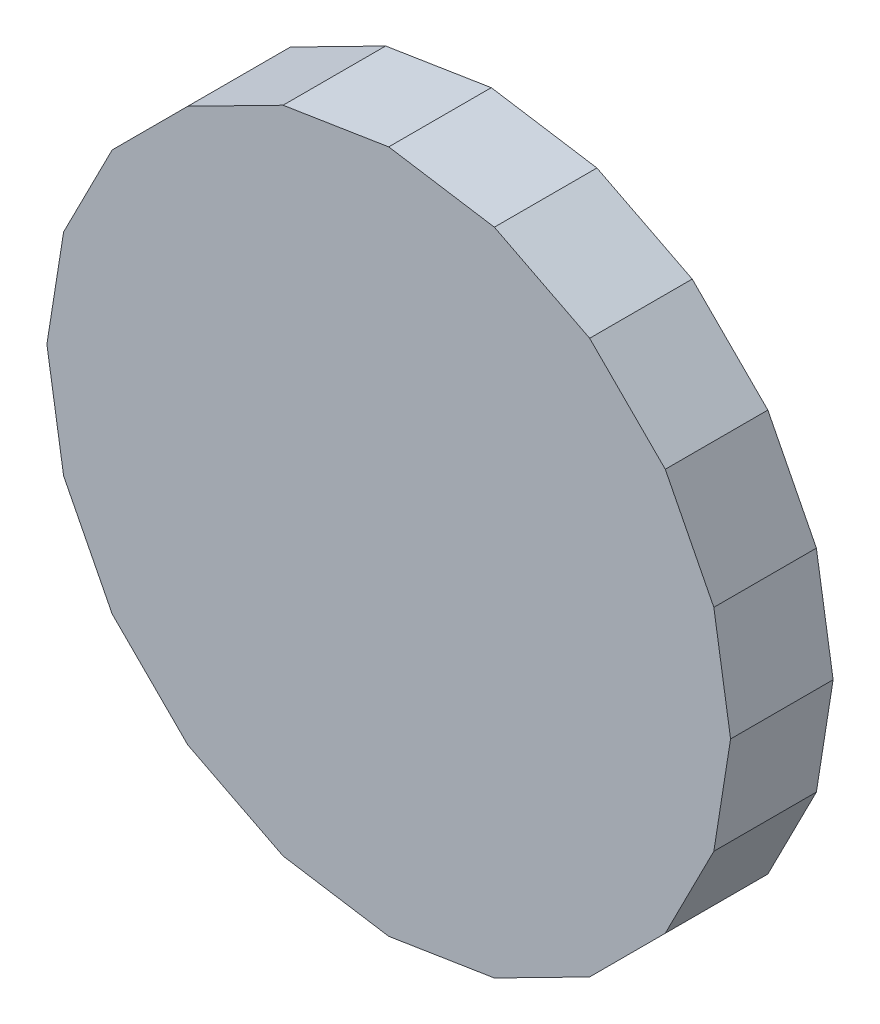
ISO-10303-21;
HEADER;
FILE_DESCRIPTION(('STEP AP214'),'2;1');
FILE_NAME('part.step','',(''),(''),'','','');
FILE_SCHEMA(('AUTOMOTIVE_DESIGN { 1 0 10303 214 1 1 1 1 }'));
ENDSEC;
DATA;
#1=APPLICATION_CONTEXT('core data for automotive mechanical design processes');
#2=APPLICATION_PROTOCOL_DEFINITION('international standard','automotive_design',2000,#1);
#3=PRODUCT_CONTEXT('',#1,'mechanical');
#4=PRODUCT('Part','Part','',(#3));
#5=PRODUCT_RELATED_PRODUCT_CATEGORY('part','',(#4));
#6=PRODUCT_DEFINITION_FORMATION('','',#4);
#7=PRODUCT_DEFINITION_CONTEXT('part definition',#1,'design');
#8=PRODUCT_DEFINITION('design','',#6,#7);
#9=PRODUCT_DEFINITION_SHAPE('','',#8);
#10=(LENGTH_UNIT() NAMED_UNIT(*) SI_UNIT(.MILLI.,.METRE.));
#11=(NAMED_UNIT(*) PLANE_ANGLE_UNIT() SI_UNIT($,.RADIAN.));
#12=(NAMED_UNIT(*) SI_UNIT($,.STERADIAN.) SOLID_ANGLE_UNIT());
#13=UNCERTAINTY_MEASURE_WITH_UNIT(LENGTH_MEASURE(1.E-05),#10,'distance_accuracy_value','');
#14=(GEOMETRIC_REPRESENTATION_CONTEXT(3) GLOBAL_UNCERTAINTY_ASSIGNED_CONTEXT((#13)) GLOBAL_UNIT_ASSIGNED_CONTEXT((#10,
#11,#12)) REPRESENTATION_CONTEXT('',''));
#15=CARTESIAN_POINT('',(0.,0.,0.));
#16=DIRECTION('',(0.,0.,1.));
#17=DIRECTION('',(1.,0.,0.));
#18=AXIS2_PLACEMENT_3D('',#15,#16,#17);
#19=CARTESIAN_POINT('',(95.1056516295157,-30.9016994374937,30.));
#20=DIRECTION('',(-0.987688340595139,0.156434465040221,0.));
#21=DIRECTION('',(-0.156434465040221,-0.987688340595139,0.));
#22=AXIS2_PLACEMENT_3D('',#19,#20,#21);
#23=PLANE('',#22);
#24=DIRECTION('',(0.156434465040221,0.987688340595139,0.));
#25=VECTOR('',#24,1.);
#26=CARTESIAN_POINT('',(95.1056516295157,-30.9016994374937,0.));
#27=LINE('',#26,#25);
#28=CARTESIAN_POINT('',(95.1056516295157,-30.9016994374937,0.));
#29=VERTEX_POINT('',#28);
#30=CARTESIAN_POINT('',(100.,1.14838694109665E-12,0.));
#31=VERTEX_POINT('',#30);
#32=EDGE_CURVE('E209',#29,#31,#27,.T.);
#33=ORIENTED_EDGE('',*,*,#32,.T.);
#34=DIRECTION('',(0.,0.,-1.));
#35=VECTOR('',#34,1.);
#36=CARTESIAN_POINT('',(100.,1.14838694109665E-12,30.));
#37=LINE('',#36,#35);
#38=CARTESIAN_POINT('',(100.,1.14838694109665E-12,30.));
#39=VERTEX_POINT('',#38);
#40=EDGE_CURVE('E11',#39,#31,#37,.T.);
#41=ORIENTED_EDGE('',*,*,#40,.F.);
#42=DIRECTION('',(0.156434465040221,0.987688340595139,0.));
#43=VECTOR('',#42,1.);
#44=CARTESIAN_POINT('',(95.1056516295157,-30.9016994374937,30.));
#45=LINE('',#44,#43);
#46=CARTESIAN_POINT('',(95.1056516295157,-30.9016994374937,30.));
#47=VERTEX_POINT('',#46);
#48=EDGE_CURVE('E247',#47,#39,#45,.T.);
#49=ORIENTED_EDGE('',*,*,#48,.F.);
#50=DIRECTION('',(0.,0.,-1.));
#51=VECTOR('',#50,1.);
#52=CARTESIAN_POINT('',(95.1056516295157,-30.9016994374937,30.));
#53=LINE('',#52,#51);
#54=EDGE_CURVE('E205',#47,#29,#53,.T.);
#55=ORIENTED_EDGE('',*,*,#54,.T.);
#56=EDGE_LOOP('',(#33,#41,#49,#55));
#57=FACE_BOUND('',#56,.T.);
#58=ADVANCED_FACE('F41',(#57),#23,.F.);
#59=CARTESIAN_POINT('',(100.,1.14838694109665E-12,30.));
#60=DIRECTION('',(-0.987688340595136,-0.156434465040243,0.));
#61=DIRECTION('',(0.156434465040243,-0.987688340595136,0.));
#62=AXIS2_PLACEMENT_3D('',#59,#60,#61);
#63=PLANE('',#62);
#64=DIRECTION('',(-0.156434465040243,0.987688340595136,0.));
#65=VECTOR('',#64,1.);
#66=CARTESIAN_POINT('',(100.,1.14838694109665E-12,0.));
#67=LINE('',#66,#65);
#68=CARTESIAN_POINT('',(95.105651629515,30.901699437496,0.));
#69=VERTEX_POINT('',#68);
#70=EDGE_CURVE('E212',#31,#69,#67,.T.);
#71=ORIENTED_EDGE('',*,*,#70,.T.);
#72=DIRECTION('',(0.,0.,-1.));
#73=VECTOR('',#72,1.);
#74=CARTESIAN_POINT('',(95.105651629515,30.901699437496,30.));
#75=LINE('',#74,#73);
#76=CARTESIAN_POINT('',(95.105651629515,30.901699437496,30.));
#77=VERTEX_POINT('',#76);
#78=EDGE_CURVE('E49',#77,#69,#75,.T.);
#79=ORIENTED_EDGE('',*,*,#78,.F.);
#80=DIRECTION('',(-0.156434465040243,0.987688340595136,0.));
#81=VECTOR('',#80,1.);
#82=CARTESIAN_POINT('',(100.,1.14838694109665E-12,30.));
#83=LINE('',#82,#81);
#84=EDGE_CURVE('E136',#39,#77,#83,.T.);
#85=ORIENTED_EDGE('',*,*,#84,.F.);
#86=ORIENTED_EDGE('',*,*,#40,.T.);
#87=EDGE_LOOP('',(#71,#79,#85,#86));
#88=FACE_BOUND('',#87,.T.);
#89=ADVANCED_FACE('F365',(#88),#63,.F.);
#90=CARTESIAN_POINT('',(95.105651629515,30.901699437496,30.));
#91=DIRECTION('',(-0.891006524188364,-0.453990499739555,0.));
#92=DIRECTION('',(0.453990499739555,-0.891006524188364,0.));
#93=AXIS2_PLACEMENT_3D('',#90,#91,#92);
#94=PLANE('',#93);
#95=DIRECTION('',(-0.453990499739555,0.891006524188364,0.));
#96=VECTOR('',#95,1.);
#97=CARTESIAN_POINT('',(95.105651629515,30.901699437496,0.));
#98=LINE('',#97,#96);
#99=CARTESIAN_POINT('',(80.9016994374942,58.7785252292483,0.));
#100=VERTEX_POINT('',#99);
#101=EDGE_CURVE('E214',#69,#100,#98,.T.);
#102=ORIENTED_EDGE('',*,*,#101,.T.);
#103=DIRECTION('',(0.,0.,-1.));
#104=VECTOR('',#103,1.);
#105=CARTESIAN_POINT('',(80.9016994374942,58.7785252292483,30.));
#106=LINE('',#105,#104);
#107=CARTESIAN_POINT('',(80.9016994374942,58.7785252292483,30.));
#108=VERTEX_POINT('',#107);
#109=EDGE_CURVE('E290',#108,#100,#106,.T.);
#110=ORIENTED_EDGE('',*,*,#109,.F.);
#111=DIRECTION('',(-0.453990499739555,0.891006524188364,0.));
#112=VECTOR('',#111,1.);
#113=CARTESIAN_POINT('',(95.105651629515,30.901699437496,30.));
#114=LINE('',#113,#112);
#115=EDGE_CURVE('E298',#77,#108,#114,.T.);
#116=ORIENTED_EDGE('',*,*,#115,.F.);
#117=ORIENTED_EDGE('',*,*,#78,.T.);
#118=EDGE_LOOP('',(#102,#110,#116,#117));
#119=FACE_BOUND('',#118,.T.);
#120=ADVANCED_FACE('F296',(#119),#94,.F.);
#121=CARTESIAN_POINT('',(80.9016994374942,58.7785252292483,30.));
#122=DIRECTION('',(-0.70710678118654,-0.707106781186555,0.));
#123=DIRECTION('',(0.707106781186555,-0.70710678118654,0.));
#124=AXIS2_PLACEMENT_3D('',#121,#122,#123);
#125=PLANE('',#124);
#126=DIRECTION('',(-0.707106781186555,0.70710678118654,0.));
#127=VECTOR('',#126,1.);
#128=CARTESIAN_POINT('',(80.9016994374942,58.7785252292483,0.));
#129=LINE('',#128,#127);
#130=CARTESIAN_POINT('',(58.7785252292465,80.9016994374955,0.));
#131=VERTEX_POINT('',#130);
#132=EDGE_CURVE('E216',#100,#131,#129,.T.);
#133=ORIENTED_EDGE('',*,*,#132,.T.);
#134=DIRECTION('',(0.,0.,-1.));
#135=VECTOR('',#134,1.);
#136=CARTESIAN_POINT('',(58.7785252292465,80.9016994374955,30.));
#137=LINE('',#136,#135);
#138=CARTESIAN_POINT('',(58.7785252292465,80.9016994374955,30.));
#139=VERTEX_POINT('',#138);
#140=EDGE_CURVE('E287',#139,#131,#137,.T.);
#141=ORIENTED_EDGE('',*,*,#140,.F.);
#142=DIRECTION('',(-0.707106781186555,0.70710678118654,0.));
#143=VECTOR('',#142,1.);
#144=CARTESIAN_POINT('',(80.9016994374942,58.7785252292483,30.));
#145=LINE('',#144,#143);
#146=EDGE_CURVE('E316',#108,#139,#145,.T.);
#147=ORIENTED_EDGE('',*,*,#146,.F.);
#148=ORIENTED_EDGE('',*,*,#109,.T.);
#149=EDGE_LOOP('',(#133,#141,#147,#148));
#150=FACE_BOUND('',#149,.T.);
#151=ADVANCED_FACE('F307',(#150),#125,.F.);
#152=CARTESIAN_POINT('',(58.7785252292465,80.9016994374955,30.));
#153=DIRECTION('',(-0.453990499739535,-0.891006524188374,0.));
#154=DIRECTION('',(0.891006524188374,-0.453990499739535,0.));
#155=AXIS2_PLACEMENT_3D('',#152,#153,#154);
#156=PLANE('',#155);
#157=DIRECTION('',(-0.891006524188374,0.453990499739535,0.));
#158=VECTOR('',#157,1.);
#159=CARTESIAN_POINT('',(58.7785252292465,80.9016994374955,0.));
#160=LINE('',#159,#158);
#161=CARTESIAN_POINT('',(30.9016994374936,95.1056516295158,0.));
#162=VERTEX_POINT('',#161);
#163=EDGE_CURVE('E218',#131,#162,#160,.T.);
#164=ORIENTED_EDGE('',*,*,#163,.T.);
#165=DIRECTION('',(0.,0.,-1.));
#166=VECTOR('',#165,1.);
#167=CARTESIAN_POINT('',(30.9016994374936,95.1056516295158,30.));
#168=LINE('',#167,#166);
#169=CARTESIAN_POINT('',(30.9016994374936,95.1056516295158,30.));
#170=VERTEX_POINT('',#169);
#171=EDGE_CURVE('E284',#170,#162,#168,.T.);
#172=ORIENTED_EDGE('',*,*,#171,.F.);
#173=DIRECTION('',(-0.891006524188374,0.453990499739535,0.));
#174=VECTOR('',#173,1.);
#175=CARTESIAN_POINT('',(58.7785252292465,80.9016994374955,30.));
#176=LINE('',#175,#174);
#177=EDGE_CURVE('E313',#139,#170,#176,.T.);
#178=ORIENTED_EDGE('',*,*,#177,.F.);
#179=ORIENTED_EDGE('',*,*,#140,.T.);
#180=EDGE_LOOP('',(#164,#172,#178,#179));
#181=FACE_BOUND('',#180,.T.);
#182=ADVANCED_FACE('F311',(#181),#156,.F.);
#183=CARTESIAN_POINT('',(30.9016994374936,95.1056516295158,30.));
#184=DIRECTION('',(-0.156434465040219,-0.98768834059514,0.));
#185=DIRECTION('',(0.98768834059514,-0.156434465040219,0.));
#186=AXIS2_PLACEMENT_3D('',#183,#184,#185);
#187=PLANE('',#186);
#188=DIRECTION('',(-0.98768834059514,0.156434465040219,0.));
#189=VECTOR('',#188,1.);
#190=CARTESIAN_POINT('',(30.9016994374936,95.1056516295158,0.));
#191=LINE('',#190,#189);
#192=CARTESIAN_POINT('',(-1.12757025938492E-12,100.,0.));
#193=VERTEX_POINT('',#192);
#194=EDGE_CURVE('E220',#162,#193,#191,.T.);
#195=ORIENTED_EDGE('',*,*,#194,.T.);
#196=DIRECTION('',(0.,0.,-1.));
#197=VECTOR('',#196,1.);
#198=CARTESIAN_POINT('',(-1.12757025938492E-12,100.,30.));
#199=LINE('',#198,#197);
#200=CARTESIAN_POINT('',(-1.12757025938492E-12,100.,30.));
#201=VERTEX_POINT('',#200);
#202=EDGE_CURVE('E281',#201,#193,#199,.T.);
#203=ORIENTED_EDGE('',*,*,#202,.F.);
#204=DIRECTION('',(-0.98768834059514,0.156434465040219,0.));
#205=VECTOR('',#204,1.);
#206=CARTESIAN_POINT('',(30.9016994374936,95.1056516295158,30.));
#207=LINE('',#206,#205);
#208=EDGE_CURVE('E315',#170,#201,#207,.T.);
#209=ORIENTED_EDGE('',*,*,#208,.F.);
#210=ORIENTED_EDGE('',*,*,#171,.T.);
#211=EDGE_LOOP('',(#195,#203,#209,#210));
#212=FACE_BOUND('',#211,.T.);
#213=ADVANCED_FACE('F378',(#212),#187,.F.);
#214=CARTESIAN_POINT('',(-1.12757025938492E-12,100.,30.));
#215=DIRECTION('',(0.156434465040242,-0.987688340595136,0.));
#216=DIRECTION('',(0.987688340595136,0.156434465040242,0.));
#217=AXIS2_PLACEMENT_3D('',#214,#215,#216);
#218=PLANE('',#217);
#219=DIRECTION('',(-0.987688340595136,-0.156434465040242,0.));
#220=VECTOR('',#219,1.);
#221=CARTESIAN_POINT('',(-1.12757025938492E-12,100.,0.));
#222=LINE('',#221,#220);
#223=CARTESIAN_POINT('',(-30.9016994374958,95.1056516295151,0.));
#224=VERTEX_POINT('',#223);
#225=EDGE_CURVE('E222',#193,#224,#222,.T.);
#226=ORIENTED_EDGE('',*,*,#225,.T.);
#227=DIRECTION('',(0.,0.,-1.));
#228=VECTOR('',#227,1.);
#229=CARTESIAN_POINT('',(-30.9016994374958,95.1056516295151,30.));
#230=LINE('',#229,#228);
#231=CARTESIAN_POINT('',(-30.9016994374958,95.1056516295151,30.));
#232=VERTEX_POINT('',#231);
#233=EDGE_CURVE('E278',#232,#224,#230,.T.);
#234=ORIENTED_EDGE('',*,*,#233,.F.);
#235=DIRECTION('',(-0.987688340595136,-0.156434465040242,0.));
#236=VECTOR('',#235,1.);
#237=CARTESIAN_POINT('',(-1.12757025938492E-12,100.,30.));
#238=LINE('',#237,#236);
#239=EDGE_CURVE('E318',#201,#232,#238,.T.);
#240=ORIENTED_EDGE('',*,*,#239,.F.);
#241=ORIENTED_EDGE('',*,*,#202,.T.);
#242=EDGE_LOOP('',(#226,#234,#240,#241));
#243=FACE_BOUND('',#242,.T.);
#244=ADVANCED_FACE('F381',(#243),#218,.F.);
#245=CARTESIAN_POINT('',(-30.9016994374958,95.1056516295151,30.));
#246=DIRECTION('',(0.453990499739557,-0.891006524188363,0.));
#247=DIRECTION('',(0.891006524188363,0.453990499739557,0.));
#248=AXIS2_PLACEMENT_3D('',#245,#246,#247);
#249=PLANE('',#248);
#250=DIRECTION('',(-0.891006524188362,-0.453990499739557,0.));
#251=VECTOR('',#250,1.);
#252=CARTESIAN_POINT('',(-30.9016994374958,95.1056516295151,0.));
#253=LINE('',#252,#251);
#254=CARTESIAN_POINT('',(-58.7785252292482,80.9016994374941,0.));
#255=VERTEX_POINT('',#254);
#256=EDGE_CURVE('E224',#224,#255,#253,.T.);
#257=ORIENTED_EDGE('',*,*,#256,.T.);
#258=DIRECTION('',(0.,0.,-1.));
#259=VECTOR('',#258,1.);
#260=CARTESIAN_POINT('',(-58.7785252292482,80.9016994374941,30.));
#261=LINE('',#260,#259);
#262=CARTESIAN_POINT('',(-58.7785252292482,80.9016994374941,30.));
#263=VERTEX_POINT('',#262);
#264=EDGE_CURVE('E275',#263,#255,#261,.T.);
#265=ORIENTED_EDGE('',*,*,#264,.F.);
#266=DIRECTION('',(-0.891006524188362,-0.453990499739557,0.));
#267=VECTOR('',#266,1.);
#268=CARTESIAN_POINT('',(-30.9016994374958,95.1056516295151,30.));
#269=LINE('',#268,#267);
#270=EDGE_CURVE('E324',#232,#263,#269,.T.);
#271=ORIENTED_EDGE('',*,*,#270,.F.);
#272=ORIENTED_EDGE('',*,*,#233,.T.);
#273=EDGE_LOOP('',(#257,#265,#271,#272));
#274=FACE_BOUND('',#273,.T.);
#275=ADVANCED_FACE('F385',(#274),#249,.F.);
#276=CARTESIAN_POINT('',(-58.7785252292482,80.9016994374941,30.));
#277=DIRECTION('',(0.707106781186555,-0.70710678118654,0.));
#278=DIRECTION('',(0.70710678118654,0.707106781186555,0.));
#279=AXIS2_PLACEMENT_3D('',#276,#277,#278);
#280=PLANE('',#279);
#281=DIRECTION('',(-0.70710678118654,-0.707106781186555,0.));
#282=VECTOR('',#281,1.);
#283=CARTESIAN_POINT('',(-58.7785252292482,80.9016994374941,0.));
#284=LINE('',#283,#282);
#285=CARTESIAN_POINT('',(-80.9016994374954,58.7785252292465,0.));
#286=VERTEX_POINT('',#285);
#287=EDGE_CURVE('E226',#255,#286,#284,.T.);
#288=ORIENTED_EDGE('',*,*,#287,.T.);
#289=DIRECTION('',(0.,0.,-1.));
#290=VECTOR('',#289,1.);
#291=CARTESIAN_POINT('',(-80.9016994374954,58.7785252292465,30.));
#292=LINE('',#291,#290);
#293=CARTESIAN_POINT('',(-80.9016994374954,58.7785252292465,30.));
#294=VERTEX_POINT('',#293);
#295=EDGE_CURVE('E272',#294,#286,#292,.T.);
#296=ORIENTED_EDGE('',*,*,#295,.F.);
#297=DIRECTION('',(-0.70710678118654,-0.707106781186555,0.));
#298=VECTOR('',#297,1.);
#299=CARTESIAN_POINT('',(-58.7785252292482,80.9016994374941,30.));
#300=LINE('',#299,#298);
#301=EDGE_CURVE('E326',#263,#294,#300,.T.);
#302=ORIENTED_EDGE('',*,*,#301,.F.);
#303=ORIENTED_EDGE('',*,*,#264,.T.);
#304=EDGE_LOOP('',(#288,#296,#302,#303));
#305=FACE_BOUND('',#304,.T.);
#306=ADVANCED_FACE('F389',(#305),#280,.F.);
#307=CARTESIAN_POINT('',(-80.9016994374954,58.7785252292465,30.));
#308=DIRECTION('',(0.891006524188373,-0.453990499739538,0.));
#309=DIRECTION('',(0.453990499739538,0.891006524188373,0.));
#310=AXIS2_PLACEMENT_3D('',#307,#308,#309);
#311=PLANE('',#310);
#312=DIRECTION('',(-0.453990499739537,-0.891006524188373,0.));
#313=VECTOR('',#312,1.);
#314=CARTESIAN_POINT('',(-80.9016994374954,58.7785252292465,0.));
#315=LINE('',#314,#313);
#316=CARTESIAN_POINT('',(-95.1056516295158,30.9016994374937,0.));
#317=VERTEX_POINT('',#316);
#318=EDGE_CURVE('E228',#286,#317,#315,.T.);
#319=ORIENTED_EDGE('',*,*,#318,.T.);
#320=DIRECTION('',(0.,0.,-1.));
#321=VECTOR('',#320,1.);
#322=CARTESIAN_POINT('',(-95.1056516295158,30.9016994374937,30.));
#323=LINE('',#322,#321);
#324=CARTESIAN_POINT('',(-95.1056516295158,30.9016994374937,30.));
#325=VERTEX_POINT('',#324);
#326=EDGE_CURVE('E269',#325,#317,#323,.T.);
#327=ORIENTED_EDGE('',*,*,#326,.F.);
#328=DIRECTION('',(-0.453990499739537,-0.891006524188373,0.));
#329=VECTOR('',#328,1.);
#330=CARTESIAN_POINT('',(-80.9016994374954,58.7785252292465,30.));
#331=LINE('',#330,#329);
#332=EDGE_CURVE('E328',#294,#325,#331,.T.);
#333=ORIENTED_EDGE('',*,*,#332,.F.);
#334=ORIENTED_EDGE('',*,*,#295,.T.);
#335=EDGE_LOOP('',(#319,#327,#333,#334));
#336=FACE_BOUND('',#335,.T.);
#337=ADVANCED_FACE('F393',(#336),#311,.F.);
#338=CARTESIAN_POINT('',(-95.1056516295158,30.9016994374937,30.));
#339=DIRECTION('',(0.98768834059514,-0.156434465040219,0.));
#340=DIRECTION('',(0.156434465040219,0.98768834059514,0.));
#341=AXIS2_PLACEMENT_3D('',#338,#339,#340);
#342=PLANE('',#341);
#343=DIRECTION('',(-0.156434465040219,-0.98768834059514,0.));
#344=VECTOR('',#343,1.);
#345=CARTESIAN_POINT('',(-95.1056516295158,30.9016994374937,0.));
#346=LINE('',#345,#344);
#347=CARTESIAN_POINT('',(-100.,-1.11716191852906E-12,0.));
#348=VERTEX_POINT('',#347);
#349=EDGE_CURVE('E230',#317,#348,#346,.T.);
#350=ORIENTED_EDGE('',*,*,#349,.T.);
#351=DIRECTION('',(0.,0.,-1.));
#352=VECTOR('',#351,1.);
#353=CARTESIAN_POINT('',(-100.,-1.11716191852906E-12,30.));
#354=LINE('',#353,#352);
#355=CARTESIAN_POINT('',(-100.,-1.11716191852906E-12,30.));
#356=VERTEX_POINT('',#355);
#357=EDGE_CURVE('E266',#356,#348,#354,.T.);
#358=ORIENTED_EDGE('',*,*,#357,.F.);
#359=DIRECTION('',(-0.156434465040219,-0.98768834059514,0.));
#360=VECTOR('',#359,1.);
#361=CARTESIAN_POINT('',(-95.1056516295158,30.9016994374937,30.));
#362=LINE('',#361,#360);
#363=EDGE_CURVE('E330',#325,#356,#362,.T.);
#364=ORIENTED_EDGE('',*,*,#363,.F.);
#365=ORIENTED_EDGE('',*,*,#326,.T.);
#366=EDGE_LOOP('',(#350,#358,#364,#365));
#367=FACE_BOUND('',#366,.T.);
#368=ADVANCED_FACE('F397',(#367),#342,.F.);
#369=CARTESIAN_POINT('',(-100.,-1.11716191852906E-12,30.));
#370=DIRECTION('',(0.987688340595136,0.156434465040243,0.));
#371=DIRECTION('',(-0.156434465040243,0.987688340595136,0.));
#372=AXIS2_PLACEMENT_3D('',#369,#370,#371);
#373=PLANE('',#372);
#374=DIRECTION('',(0.156434465040243,-0.987688340595136,0.));
#375=VECTOR('',#374,1.);
#376=CARTESIAN_POINT('',(-100.,-1.11716191852906E-12,0.));
#377=LINE('',#376,#375);
#378=CARTESIAN_POINT('',(-95.105651629515,-30.9016994374958,0.));
#379=VERTEX_POINT('',#378);
#380=EDGE_CURVE('E232',#348,#379,#377,.T.);
#381=ORIENTED_EDGE('',*,*,#380,.T.);
#382=DIRECTION('',(0.,0.,-1.));
#383=VECTOR('',#382,1.);
#384=CARTESIAN_POINT('',(-95.105651629515,-30.9016994374958,30.));
#385=LINE('',#384,#383);
#386=CARTESIAN_POINT('',(-95.105651629515,-30.9016994374958,30.));
#387=VERTEX_POINT('',#386);
#388=EDGE_CURVE('E263',#387,#379,#385,.T.);
#389=ORIENTED_EDGE('',*,*,#388,.F.);
#390=DIRECTION('',(0.156434465040243,-0.987688340595136,0.));
#391=VECTOR('',#390,1.);
#392=CARTESIAN_POINT('',(-100.,-1.11716191852906E-12,30.));
#393=LINE('',#392,#391);
#394=EDGE_CURVE('E332',#356,#387,#393,.T.);
#395=ORIENTED_EDGE('',*,*,#394,.F.);
#396=ORIENTED_EDGE('',*,*,#357,.T.);
#397=EDGE_LOOP('',(#381,#389,#395,#396));
#398=FACE_BOUND('',#397,.T.);
#399=ADVANCED_FACE('F401',(#398),#373,.F.);
#400=CARTESIAN_POINT('',(-95.105651629515,-30.9016994374958,30.));
#401=DIRECTION('',(0.891006524188363,0.453990499739556,0.));
#402=DIRECTION('',(-0.453990499739556,0.891006524188363,0.));
#403=AXIS2_PLACEMENT_3D('',#400,#401,#402);
#404=PLANE('',#403);
#405=DIRECTION('',(0.453990499739556,-0.891006524188363,0.));
#406=VECTOR('',#405,1.);
#407=CARTESIAN_POINT('',(-95.105651629515,-30.9016994374958,0.));
#408=LINE('',#407,#406);
#409=CARTESIAN_POINT('',(-80.9016994374941,-58.7785252292483,0.));
#410=VERTEX_POINT('',#409);
#411=EDGE_CURVE('E234',#379,#410,#408,.T.);
#412=ORIENTED_EDGE('',*,*,#411,.T.);
#413=DIRECTION('',(0.,0.,-1.));
#414=VECTOR('',#413,1.);
#415=CARTESIAN_POINT('',(-80.9016994374941,-58.7785252292483,30.));
#416=LINE('',#415,#414);
#417=CARTESIAN_POINT('',(-80.9016994374941,-58.7785252292483,30.));
#418=VERTEX_POINT('',#417);
#419=EDGE_CURVE('E260',#418,#410,#416,.T.);
#420=ORIENTED_EDGE('',*,*,#419,.F.);
#421=DIRECTION('',(0.453990499739556,-0.891006524188363,0.));
#422=VECTOR('',#421,1.);
#423=CARTESIAN_POINT('',(-95.105651629515,-30.9016994374958,30.));
#424=LINE('',#423,#422);
#425=EDGE_CURVE('E334',#387,#418,#424,.T.);
#426=ORIENTED_EDGE('',*,*,#425,.F.);
#427=ORIENTED_EDGE('',*,*,#388,.T.);
#428=EDGE_LOOP('',(#412,#420,#426,#427));
#429=FACE_BOUND('',#428,.T.);
#430=ADVANCED_FACE('F405',(#429),#404,.F.);
#431=CARTESIAN_POINT('',(-80.9016994374941,-58.7785252292483,30.));
#432=DIRECTION('',(0.70710678118654,0.707106781186555,0.));
#433=DIRECTION('',(-0.707106781186555,0.70710678118654,0.));
#434=AXIS2_PLACEMENT_3D('',#431,#432,#433);
#435=PLANE('',#434);
#436=DIRECTION('',(0.707106781186555,-0.70710678118654,0.));
#437=VECTOR('',#436,1.);
#438=CARTESIAN_POINT('',(-80.9016994374941,-58.7785252292483,0.));
#439=LINE('',#438,#437);
#440=CARTESIAN_POINT('',(-58.7785252292464,-80.9016994374955,0.));
#441=VERTEX_POINT('',#440);
#442=EDGE_CURVE('E236',#410,#441,#439,.T.);
#443=ORIENTED_EDGE('',*,*,#442,.T.);
#444=DIRECTION('',(0.,0.,-1.));
#445=VECTOR('',#444,1.);
#446=CARTESIAN_POINT('',(-58.7785252292464,-80.9016994374955,30.));
#447=LINE('',#446,#445);
#448=CARTESIAN_POINT('',(-58.7785252292464,-80.9016994374955,30.));
#449=VERTEX_POINT('',#448);
#450=EDGE_CURVE('E257',#449,#441,#447,.T.);
#451=ORIENTED_EDGE('',*,*,#450,.F.);
#452=DIRECTION('',(0.707106781186555,-0.70710678118654,0.));
#453=VECTOR('',#452,1.);
#454=CARTESIAN_POINT('',(-80.9016994374941,-58.7785252292483,30.));
#455=LINE('',#454,#453);
#456=EDGE_CURVE('E336',#418,#449,#455,.T.);
#457=ORIENTED_EDGE('',*,*,#456,.F.);
#458=ORIENTED_EDGE('',*,*,#419,.T.);
#459=EDGE_LOOP('',(#443,#451,#457,#458));
#460=FACE_BOUND('',#459,.T.);
#461=ADVANCED_FACE('F409',(#460),#435,.F.);
#462=CARTESIAN_POINT('',(-58.7785252292464,-80.9016994374955,30.));
#463=DIRECTION('',(0.453990499739535,0.891006524188374,0.));
#464=DIRECTION('',(-0.891006524188374,0.453990499739535,0.));
#465=AXIS2_PLACEMENT_3D('',#462,#463,#464);
#466=PLANE('',#465);
#467=DIRECTION('',(0.891006524188374,-0.453990499739535,0.));
#468=VECTOR('',#467,1.);
#469=CARTESIAN_POINT('',(-58.7785252292464,-80.9016994374955,0.));
#470=LINE('',#469,#468);
#471=CARTESIAN_POINT('',(-30.9016994374938,-95.1056516295157,0.));
#472=VERTEX_POINT('',#471);
#473=EDGE_CURVE('E238',#441,#472,#470,.T.);
#474=ORIENTED_EDGE('',*,*,#473,.T.);
#475=DIRECTION('',(0.,0.,-1.));
#476=VECTOR('',#475,1.);
#477=CARTESIAN_POINT('',(-30.9016994374938,-95.1056516295157,30.));
#478=LINE('',#477,#476);
#479=CARTESIAN_POINT('',(-30.9016994374938,-95.1056516295157,30.));
#480=VERTEX_POINT('',#479);
#481=EDGE_CURVE('E254',#480,#472,#478,.T.);
#482=ORIENTED_EDGE('',*,*,#481,.F.);
#483=DIRECTION('',(0.891006524188374,-0.453990499739535,0.));
#484=VECTOR('',#483,1.);
#485=CARTESIAN_POINT('',(-58.7785252292464,-80.9016994374955,30.));
#486=LINE('',#485,#484);
#487=EDGE_CURVE('E338',#449,#480,#486,.T.);
#488=ORIENTED_EDGE('',*,*,#487,.F.);
#489=ORIENTED_EDGE('',*,*,#450,.T.);
#490=EDGE_LOOP('',(#474,#482,#488,#489));
#491=FACE_BOUND('',#490,.T.);
#492=ADVANCED_FACE('F413',(#491),#466,.F.);
#493=CARTESIAN_POINT('',(-30.9016994374938,-95.1056516295157,30.));
#494=DIRECTION('',(0.15643446504022,0.987688340595139,0.));
#495=DIRECTION('',(-0.98768834059514,0.15643446504022,0.));
#496=AXIS2_PLACEMENT_3D('',#493,#494,#495);
#497=PLANE('',#496);
#498=DIRECTION('',(0.98768834059514,-0.15643446504022,0.));
#499=VECTOR('',#498,1.);
#500=CARTESIAN_POINT('',(-30.9016994374938,-95.1056516295157,0.));
#501=LINE('',#500,#499);
#502=CARTESIAN_POINT('',(1.0413211676572E-12,-100.,0.));
#503=VERTEX_POINT('',#502);
#504=EDGE_CURVE('E240',#472,#503,#501,.T.);
#505=ORIENTED_EDGE('',*,*,#504,.T.);
#506=DIRECTION('',(0.,0.,-1.));
#507=VECTOR('',#506,1.);
#508=CARTESIAN_POINT('',(1.0413211676572E-12,-100.,30.));
#509=LINE('',#508,#507);
#510=CARTESIAN_POINT('',(1.0413211676572E-12,-100.,30.));
#511=VERTEX_POINT('',#510);
#512=EDGE_CURVE('E251',#511,#503,#509,.T.);
#513=ORIENTED_EDGE('',*,*,#512,.F.);
#514=DIRECTION('',(0.98768834059514,-0.15643446504022,0.));
#515=VECTOR('',#514,1.);
#516=CARTESIAN_POINT('',(-30.9016994374938,-95.1056516295157,30.));
#517=LINE('',#516,#515);
#518=EDGE_CURVE('E340',#480,#511,#517,.T.);
#519=ORIENTED_EDGE('',*,*,#518,.F.);
#520=ORIENTED_EDGE('',*,*,#481,.T.);
#521=EDGE_LOOP('',(#505,#513,#519,#520));
#522=FACE_BOUND('',#521,.T.);
#523=ADVANCED_FACE('F346',(#522),#497,.F.);
#524=CARTESIAN_POINT('',(1.0413211676572E-12,-100.,30.));
#525=DIRECTION('',(-0.156434465040241,0.987688340595136,0.));
#526=DIRECTION('',(-0.987688340595136,-0.156434465040241,0.));
#527=AXIS2_PLACEMENT_3D('',#524,#525,#526);
#528=PLANE('',#527);
#529=DIRECTION('',(0.987688340595136,0.156434465040241,0.));
#530=VECTOR('',#529,1.);
#531=CARTESIAN_POINT('',(1.0413211676572E-12,-100.,0.));
#532=LINE('',#531,#530);
#533=CARTESIAN_POINT('',(30.9016994374958,-95.105651629515,0.));
#534=VERTEX_POINT('',#533);
#535=EDGE_CURVE('E242',#503,#534,#532,.T.);
#536=ORIENTED_EDGE('',*,*,#535,.T.);
#537=DIRECTION('',(0.,0.,-1.));
#538=VECTOR('',#537,1.);
#539=CARTESIAN_POINT('',(30.9016994374958,-95.105651629515,30.));
#540=LINE('',#539,#538);
#541=CARTESIAN_POINT('',(30.9016994374958,-95.105651629515,30.));
#542=VERTEX_POINT('',#541);
#543=EDGE_CURVE('E200',#542,#534,#540,.T.);
#544=ORIENTED_EDGE('',*,*,#543,.F.);
#545=DIRECTION('',(0.987688340595136,0.156434465040241,0.));
#546=VECTOR('',#545,1.);
#547=CARTESIAN_POINT('',(1.0413211676572E-12,-100.,30.));
#548=LINE('',#547,#546);
#549=EDGE_CURVE('E191',#511,#542,#548,.T.);
#550=ORIENTED_EDGE('',*,*,#549,.F.);
#551=ORIENTED_EDGE('',*,*,#512,.T.);
#552=EDGE_LOOP('',(#536,#544,#550,#551));
#553=FACE_BOUND('',#552,.T.);
#554=ADVANCED_FACE('F350',(#553),#528,.F.);
#555=CARTESIAN_POINT('',(30.9016994374958,-95.105651629515,30.));
#556=DIRECTION('',(-0.453990499739554,0.891006524188364,0.));
#557=DIRECTION('',(-0.891006524188364,-0.453990499739554,0.));
#558=AXIS2_PLACEMENT_3D('',#555,#556,#557);
#559=PLANE('',#558);
#560=DIRECTION('',(0.891006524188364,0.453990499739554,0.));
#561=VECTOR('',#560,1.);
#562=CARTESIAN_POINT('',(30.9016994374958,-95.105651629515,0.));
#563=LINE('',#562,#561);
#564=CARTESIAN_POINT('',(58.7785252292483,-80.9016994374942,0.));
#565=VERTEX_POINT('',#564);
#566=EDGE_CURVE('E199',#534,#565,#563,.T.);
#567=ORIENTED_EDGE('',*,*,#566,.T.);
#568=DIRECTION('',(0.,0.,-1.));
#569=VECTOR('',#568,1.);
#570=CARTESIAN_POINT('',(58.7785252292483,-80.9016994374942,30.));
#571=LINE('',#570,#569);
#572=CARTESIAN_POINT('',(58.7785252292483,-80.9016994374942,30.));
#573=VERTEX_POINT('',#572);
#574=EDGE_CURVE('E196',#573,#565,#571,.T.);
#575=ORIENTED_EDGE('',*,*,#574,.F.);
#576=DIRECTION('',(0.891006524188364,0.453990499739554,0.));
#577=VECTOR('',#576,1.);
#578=CARTESIAN_POINT('',(30.9016994374958,-95.105651629515,30.));
#579=LINE('',#578,#577);
#580=EDGE_CURVE('E185',#542,#573,#579,.T.);
#581=ORIENTED_EDGE('',*,*,#580,.F.);
#582=ORIENTED_EDGE('',*,*,#543,.T.);
#583=EDGE_LOOP('',(#567,#575,#581,#582));
#584=FACE_BOUND('',#583,.T.);
#585=ADVANCED_FACE('F197',(#584),#559,.F.);
#586=CARTESIAN_POINT('',(58.7785252292483,-80.9016994374942,30.));
#587=DIRECTION('',(-0.707106781186555,0.70710678118654,0.));
#588=DIRECTION('',(-0.70710678118654,-0.707106781186555,0.));
#589=AXIS2_PLACEMENT_3D('',#586,#587,#588);
#590=PLANE('',#589);
#591=DIRECTION('',(0.70710678118654,0.707106781186555,0.));
#592=VECTOR('',#591,1.);
#593=CARTESIAN_POINT('',(58.7785252292483,-80.9016994374942,0.));
#594=LINE('',#593,#592);
#595=CARTESIAN_POINT('',(80.9016994374955,-58.7785252292464,0.));
#596=VERTEX_POINT('',#595);
#597=EDGE_CURVE('E122',#565,#596,#594,.T.);
#598=ORIENTED_EDGE('',*,*,#597,.T.);
#599=DIRECTION('',(0.,0.,-1.));
#600=VECTOR('',#599,1.);
#601=CARTESIAN_POINT('',(80.9016994374955,-58.7785252292464,30.));
#602=LINE('',#601,#600);
#603=CARTESIAN_POINT('',(80.9016994374955,-58.7785252292464,30.));
#604=VERTEX_POINT('',#603);
#605=EDGE_CURVE('E201',#604,#596,#602,.T.);
#606=ORIENTED_EDGE('',*,*,#605,.F.);
#607=DIRECTION('',(0.70710678118654,0.707106781186555,0.));
#608=VECTOR('',#607,1.);
#609=CARTESIAN_POINT('',(58.7785252292483,-80.9016994374942,30.));
#610=LINE('',#609,#608);
#611=EDGE_CURVE('E189',#573,#604,#610,.T.);
#612=ORIENTED_EDGE('',*,*,#611,.F.);
#613=ORIENTED_EDGE('',*,*,#574,.T.);
#614=EDGE_LOOP('',(#598,#606,#612,#613));
#615=FACE_BOUND('',#614,.T.);
#616=ADVANCED_FACE('F203',(#615),#590,.F.);
#617=CARTESIAN_POINT('',(80.9016994374955,-58.7785252292464,30.));
#618=DIRECTION('',(-0.891006524188374,0.453990499739534,0.));
#619=DIRECTION('',(-0.453990499739534,-0.891006524188374,0.));
#620=AXIS2_PLACEMENT_3D('',#617,#618,#619);
#621=PLANE('',#620);
#622=DIRECTION('',(0.453990499739534,0.891006524188374,0.));
#623=VECTOR('',#622,1.);
#624=CARTESIAN_POINT('',(80.9016994374955,-58.7785252292464,0.));
#625=LINE('',#624,#623);
#626=EDGE_CURVE('E128',#596,#29,#625,.T.);
#627=ORIENTED_EDGE('',*,*,#626,.T.);
#628=ORIENTED_EDGE('',*,*,#54,.F.);
#629=DIRECTION('',(0.453990499739534,0.891006524188374,0.));
#630=VECTOR('',#629,1.);
#631=CARTESIAN_POINT('',(80.9016994374955,-58.7785252292464,30.));
#632=LINE('',#631,#630);
#633=EDGE_CURVE('E57',#604,#47,#632,.T.);
#634=ORIENTED_EDGE('',*,*,#633,.F.);
#635=ORIENTED_EDGE('',*,*,#605,.T.);
#636=EDGE_LOOP('',(#627,#628,#634,#635));
#637=FACE_BOUND('',#636,.T.);
#638=ADVANCED_FACE('F354',(#637),#621,.F.);
#639=CARTESIAN_POINT('',(0.,0.,30.));
#640=DIRECTION('',(0.,0.,1.));
#641=DIRECTION('',(1.,0.,0.));
#642=AXIS2_PLACEMENT_3D('',#639,#640,#641);
#643=PLANE('',#642);
#644=ORIENTED_EDGE('',*,*,#48,.T.);
#645=ORIENTED_EDGE('',*,*,#84,.T.);
#646=ORIENTED_EDGE('',*,*,#115,.T.);
#647=ORIENTED_EDGE('',*,*,#146,.T.);
#648=ORIENTED_EDGE('',*,*,#177,.T.);
#649=ORIENTED_EDGE('',*,*,#208,.T.);
#650=ORIENTED_EDGE('',*,*,#239,.T.);
#651=ORIENTED_EDGE('',*,*,#270,.T.);
#652=ORIENTED_EDGE('',*,*,#301,.T.);
#653=ORIENTED_EDGE('',*,*,#332,.T.);
#654=ORIENTED_EDGE('',*,*,#363,.T.);
#655=ORIENTED_EDGE('',*,*,#394,.T.);
#656=ORIENTED_EDGE('',*,*,#425,.T.);
#657=ORIENTED_EDGE('',*,*,#456,.T.);
#658=ORIENTED_EDGE('',*,*,#487,.T.);
#659=ORIENTED_EDGE('',*,*,#518,.T.);
#660=ORIENTED_EDGE('',*,*,#549,.T.);
#661=ORIENTED_EDGE('',*,*,#580,.T.);
#662=ORIENTED_EDGE('',*,*,#611,.T.);
#663=ORIENTED_EDGE('',*,*,#633,.T.);
#664=EDGE_LOOP('',(#644,#645,#646,#647,#648,#649,#650,#651,#652,#653,#654,#655,#656,#657,#658,
#659,#660,#661,#662,#663));
#665=FACE_BOUND('',#664,.T.);
#666=ADVANCED_FACE('F187',(#665),#643,.T.);
#667=CARTESIAN_POINT('',(0.,0.,0.));
#668=DIRECTION('',(0.,0.,1.));
#669=DIRECTION('',(1.,0.,0.));
#670=AXIS2_PLACEMENT_3D('',#667,#668,#669);
#671=PLANE('',#670);
#672=ORIENTED_EDGE('',*,*,#32,.F.);
#673=ORIENTED_EDGE('',*,*,#626,.F.);
#674=ORIENTED_EDGE('',*,*,#597,.F.);
#675=ORIENTED_EDGE('',*,*,#566,.F.);
#676=ORIENTED_EDGE('',*,*,#535,.F.);
#677=ORIENTED_EDGE('',*,*,#504,.F.);
#678=ORIENTED_EDGE('',*,*,#473,.F.);
#679=ORIENTED_EDGE('',*,*,#442,.F.);
#680=ORIENTED_EDGE('',*,*,#411,.F.);
#681=ORIENTED_EDGE('',*,*,#380,.F.);
#682=ORIENTED_EDGE('',*,*,#349,.F.);
#683=ORIENTED_EDGE('',*,*,#318,.F.);
#684=ORIENTED_EDGE('',*,*,#287,.F.);
#685=ORIENTED_EDGE('',*,*,#256,.F.);
#686=ORIENTED_EDGE('',*,*,#225,.F.);
#687=ORIENTED_EDGE('',*,*,#194,.F.);
#688=ORIENTED_EDGE('',*,*,#163,.F.);
#689=ORIENTED_EDGE('',*,*,#132,.F.);
#690=ORIENTED_EDGE('',*,*,#101,.F.);
#691=ORIENTED_EDGE('',*,*,#70,.F.);
#692=EDGE_LOOP('',(#672,#673,#674,#675,#676,#677,#678,#679,#680,#681,#682,#683,#684,#685,#686,
#687,#688,#689,#690,#691));
#693=FACE_BOUND('',#692,.T.);
#694=ADVANCED_FACE('F302',(#693),#671,.F.);
#695=CLOSED_SHELL('',(#58,#89,#120,#151,#182,#213,#244,#275,#306,#337,#368,#399,#430,#461,#492,
#523,#554,#585,#616,#638,#666,#694));
#696=MANIFOLD_SOLID_BREP('B2',#695);
#697=ADVANCED_BREP_SHAPE_REPRESENTATION('',(#18,#696),#14);
#698=SHAPE_DEFINITION_REPRESENTATION(#9,#697);
ENDSEC;
END-ISO-10303-21;
